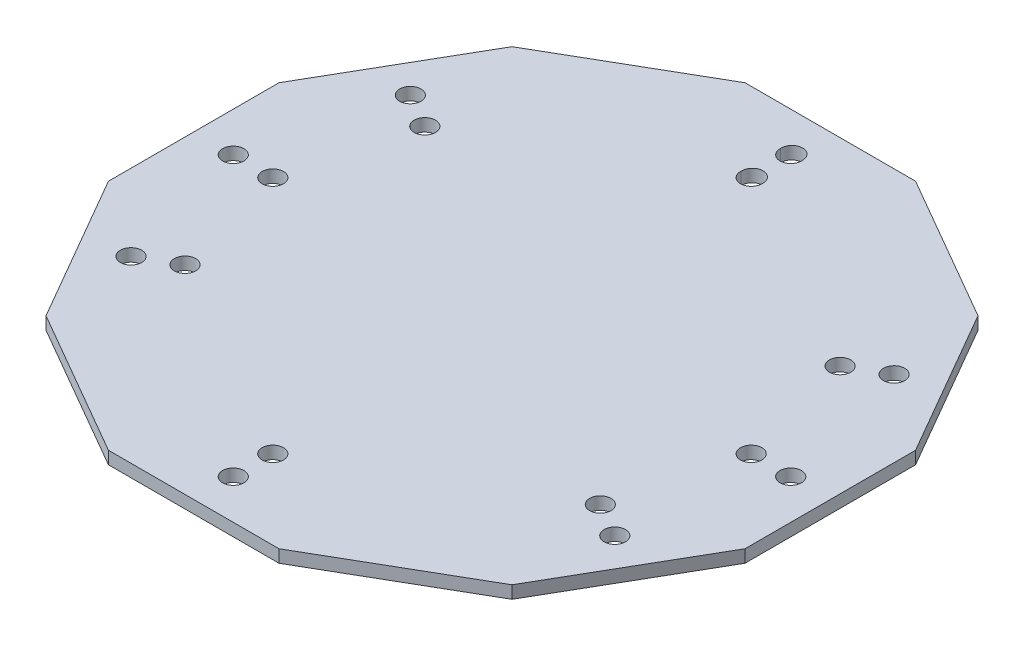
ISO-10303-21;
HEADER;
FILE_DESCRIPTION(('STEP AP214'),'2;1');
FILE_NAME('part.step','',(''),(''),'','','');
FILE_SCHEMA(('AUTOMOTIVE_DESIGN { 1 0 10303 214 1 1 1 1 }'));
ENDSEC;
DATA;
#1=APPLICATION_CONTEXT('core data for automotive mechanical design processes');
#2=APPLICATION_PROTOCOL_DEFINITION('international standard','automotive_design',2000,#1);
#3=PRODUCT_CONTEXT('',#1,'mechanical');
#4=PRODUCT('Part','Part','',(#3));
#5=PRODUCT_RELATED_PRODUCT_CATEGORY('part','',(#4));
#6=PRODUCT_DEFINITION_FORMATION('','',#4);
#7=PRODUCT_DEFINITION_CONTEXT('part definition',#1,'design');
#8=PRODUCT_DEFINITION('design','',#6,#7);
#9=PRODUCT_DEFINITION_SHAPE('','',#8);
#10=(LENGTH_UNIT() NAMED_UNIT(*) SI_UNIT(.MILLI.,.METRE.));
#11=(NAMED_UNIT(*) PLANE_ANGLE_UNIT() SI_UNIT($,.RADIAN.));
#12=(NAMED_UNIT(*) SI_UNIT($,.STERADIAN.) SOLID_ANGLE_UNIT());
#13=UNCERTAINTY_MEASURE_WITH_UNIT(LENGTH_MEASURE(1.E-05),#10,'distance_accuracy_value','');
#14=(GEOMETRIC_REPRESENTATION_CONTEXT(3) GLOBAL_UNCERTAINTY_ASSIGNED_CONTEXT((#13)) GLOBAL_UNIT_ASSIGNED_CONTEXT((#10,
#11,#12)) REPRESENTATION_CONTEXT('',''));
#15=CARTESIAN_POINT('',(0.,0.,0.));
#16=DIRECTION('',(0.,0.,1.));
#17=DIRECTION('',(1.,0.,0.));
#18=AXIS2_PLACEMENT_3D('',#15,#16,#17);
#19=CARTESIAN_POINT('',(120.740728286133,4.78,32.3523806378155));
#20=DIRECTION('',(-1.,0.,0.));
#21=DIRECTION('',(0.,0.,1.));
#22=AXIS2_PLACEMENT_3D('',#19,#20,#21);
#23=PLANE('',#22);
#24=DIRECTION('',(0.,0.,-1.));
#25=VECTOR('',#24,1.);
#26=CARTESIAN_POINT('',(120.740728286133,0.,32.3523806378155));
#27=LINE('',#26,#25);
#28=CARTESIAN_POINT('',(120.740728286133,0.,32.3523806378155));
#29=VERTEX_POINT('',#28);
#30=CARTESIAN_POINT('',(120.740728286134,0.,-32.3523806378146));
#31=VERTEX_POINT('',#30);
#32=EDGE_CURVE('E215',#29,#31,#27,.T.);
#33=ORIENTED_EDGE('',*,*,#32,.T.);
#34=DIRECTION('',(0.,-1.,0.));
#35=VECTOR('',#34,1.);
#36=CARTESIAN_POINT('',(120.740728286134,4.78,-32.3523806378146));
#37=LINE('',#36,#35);
#38=CARTESIAN_POINT('',(120.740728286134,4.78,-32.3523806378146));
#39=VERTEX_POINT('',#38);
#40=EDGE_CURVE('E302',#39,#31,#37,.T.);
#41=ORIENTED_EDGE('',*,*,#40,.F.);
#42=DIRECTION('',(0.,0.,-1.));
#43=VECTOR('',#42,1.);
#44=CARTESIAN_POINT('',(120.740728286133,4.78,32.3523806378155));
#45=LINE('',#44,#43);
#46=CARTESIAN_POINT('',(120.740728286133,4.78,32.3523806378155));
#47=VERTEX_POINT('',#46);
#48=EDGE_CURVE('E220',#47,#39,#45,.T.);
#49=ORIENTED_EDGE('',*,*,#48,.F.);
#50=DIRECTION('',(0.,-1.,0.));
#51=VECTOR('',#50,1.);
#52=CARTESIAN_POINT('',(120.740728286133,4.78,32.3523806378155));
#53=LINE('',#52,#51);
#54=EDGE_CURVE('E246',#47,#29,#53,.T.);
#55=ORIENTED_EDGE('',*,*,#54,.T.);
#56=EDGE_LOOP('',(#33,#41,#49,#55));
#57=FACE_BOUND('',#56,.T.);
#58=ADVANCED_FACE('F37',(#57),#23,.F.);
#59=CARTESIAN_POINT('',(120.740728286134,4.78,-32.3523806378146));
#60=DIRECTION('',(-0.86602540378444,0.,0.499999999999997));
#61=DIRECTION('',(0.499999999999997,0.,0.86602540378444));
#62=AXIS2_PLACEMENT_3D('',#59,#60,#61);
#63=PLANE('',#62);
#64=DIRECTION('',(-0.499999999999997,0.,-0.86602540378444));
#65=VECTOR('',#64,1.);
#66=CARTESIAN_POINT('',(120.740728286134,0.,-32.3523806378146));
#67=LINE('',#66,#65);
#68=CARTESIAN_POINT('',(88.3883476483187,0.,-88.3883476483181));
#69=VERTEX_POINT('',#68);
#70=EDGE_CURVE('E249',#31,#69,#67,.T.);
#71=ORIENTED_EDGE('',*,*,#70,.T.);
#72=DIRECTION('',(0.,-1.,0.));
#73=VECTOR('',#72,1.);
#74=CARTESIAN_POINT('',(88.3883476483187,4.78,-88.3883476483181));
#75=LINE('',#74,#73);
#76=CARTESIAN_POINT('',(88.3883476483187,4.78,-88.3883476483181));
#77=VERTEX_POINT('',#76);
#78=EDGE_CURVE('E299',#77,#69,#75,.T.);
#79=ORIENTED_EDGE('',*,*,#78,.F.);
#80=DIRECTION('',(-0.499999999999997,0.,-0.86602540378444));
#81=VECTOR('',#80,1.);
#82=CARTESIAN_POINT('',(120.740728286134,4.78,-32.3523806378146));
#83=LINE('',#82,#81);
#84=EDGE_CURVE('E223',#39,#77,#83,.T.);
#85=ORIENTED_EDGE('',*,*,#84,.F.);
#86=ORIENTED_EDGE('',*,*,#40,.T.);
#87=EDGE_LOOP('',(#71,#79,#85,#86));
#88=FACE_BOUND('',#87,.T.);
#89=ADVANCED_FACE('F381',(#88),#63,.F.);
#90=CARTESIAN_POINT('',(88.3883476483187,4.78,-88.3883476483181));
#91=DIRECTION('',(-0.500000000000003,0.,0.866025403784437));
#92=DIRECTION('',(0.866025403784437,0.,0.500000000000003));
#93=AXIS2_PLACEMENT_3D('',#90,#91,#92);
#94=PLANE('',#93);
#95=DIRECTION('',(-0.866025403784437,0.,-0.500000000000003));
#96=VECTOR('',#95,1.);
#97=CARTESIAN_POINT('',(88.3883476483187,0.,-88.3883476483181));
#98=LINE('',#97,#96);
#99=CARTESIAN_POINT('',(32.3523806378154,0.,-120.740728286133));
#100=VERTEX_POINT('',#99);
#101=EDGE_CURVE('E251',#69,#100,#98,.T.);
#102=ORIENTED_EDGE('',*,*,#101,.T.);
#103=DIRECTION('',(0.,-1.,0.));
#104=VECTOR('',#103,1.);
#105=CARTESIAN_POINT('',(32.3523806378154,4.78,-120.740728286133));
#106=LINE('',#105,#104);
#107=CARTESIAN_POINT('',(32.3523806378154,4.78,-120.740728286133));
#108=VERTEX_POINT('',#107);
#109=EDGE_CURVE('E296',#108,#100,#106,.T.);
#110=ORIENTED_EDGE('',*,*,#109,.F.);
#111=DIRECTION('',(-0.866025403784437,0.,-0.500000000000003));
#112=VECTOR('',#111,1.);
#113=CARTESIAN_POINT('',(88.3883476483187,4.78,-88.3883476483181));
#114=LINE('',#113,#112);
#115=EDGE_CURVE('E226',#77,#108,#114,.T.);
#116=ORIENTED_EDGE('',*,*,#115,.F.);
#117=ORIENTED_EDGE('',*,*,#78,.T.);
#118=EDGE_LOOP('',(#102,#110,#116,#117));
#119=FACE_BOUND('',#118,.T.);
#120=ADVANCED_FACE('F386',(#119),#94,.F.);
#121=CARTESIAN_POINT('',(32.3523806378154,4.78,-120.740728286133));
#122=DIRECTION('',(0.,0.,1.));
#123=DIRECTION('',(1.,0.,0.));
#124=AXIS2_PLACEMENT_3D('',#121,#122,#123);
#125=PLANE('',#124);
#126=DIRECTION('',(-1.,0.,0.));
#127=VECTOR('',#126,1.);
#128=CARTESIAN_POINT('',(32.3523806378154,0.,-120.740728286133));
#129=LINE('',#128,#127);
#130=CARTESIAN_POINT('',(-32.3523806378146,0.,-120.740728286134));
#131=VERTEX_POINT('',#130);
#132=EDGE_CURVE('E253',#100,#131,#129,.T.);
#133=ORIENTED_EDGE('',*,*,#132,.T.);
#134=DIRECTION('',(0.,-1.,0.));
#135=VECTOR('',#134,1.);
#136=CARTESIAN_POINT('',(-32.3523806378146,4.78,-120.740728286134));
#137=LINE('',#136,#135);
#138=CARTESIAN_POINT('',(-32.3523806378146,4.78,-120.740728286134));
#139=VERTEX_POINT('',#138);
#140=EDGE_CURVE('E293',#139,#131,#137,.T.);
#141=ORIENTED_EDGE('',*,*,#140,.F.);
#142=DIRECTION('',(-1.,0.,0.));
#143=VECTOR('',#142,1.);
#144=CARTESIAN_POINT('',(32.3523806378154,4.78,-120.740728286133));
#145=LINE('',#144,#143);
#146=EDGE_CURVE('E228',#108,#139,#145,.T.);
#147=ORIENTED_EDGE('',*,*,#146,.F.);
#148=ORIENTED_EDGE('',*,*,#109,.T.);
#149=EDGE_LOOP('',(#133,#141,#147,#148));
#150=FACE_BOUND('',#149,.T.);
#151=ADVANCED_FACE('F392',(#150),#125,.F.);
#152=CARTESIAN_POINT('',(-32.3523806378146,4.78,-120.740728286134));
#153=DIRECTION('',(0.499999999999997,0.,0.86602540378444));
#154=DIRECTION('',(0.86602540378444,0.,-0.499999999999997));
#155=AXIS2_PLACEMENT_3D('',#152,#153,#154);
#156=PLANE('',#155);
#157=DIRECTION('',(-0.86602540378444,0.,0.499999999999997));
#158=VECTOR('',#157,1.);
#159=CARTESIAN_POINT('',(-32.3523806378146,0.,-120.740728286134));
#160=LINE('',#159,#158);
#161=CARTESIAN_POINT('',(-88.3883476483181,0.,-88.3883476483187));
#162=VERTEX_POINT('',#161);
#163=EDGE_CURVE('E255',#131,#162,#160,.T.);
#164=ORIENTED_EDGE('',*,*,#163,.T.);
#165=DIRECTION('',(0.,-1.,0.));
#166=VECTOR('',#165,1.);
#167=CARTESIAN_POINT('',(-88.3883476483181,4.78,-88.3883476483187));
#168=LINE('',#167,#166);
#169=CARTESIAN_POINT('',(-88.3883476483181,4.78,-88.3883476483187));
#170=VERTEX_POINT('',#169);
#171=EDGE_CURVE('E290',#170,#162,#168,.T.);
#172=ORIENTED_EDGE('',*,*,#171,.F.);
#173=DIRECTION('',(-0.86602540378444,0.,0.499999999999997));
#174=VECTOR('',#173,1.);
#175=CARTESIAN_POINT('',(-32.3523806378146,4.78,-120.740728286134));
#176=LINE('',#175,#174);
#177=EDGE_CURVE('E230',#139,#170,#176,.T.);
#178=ORIENTED_EDGE('',*,*,#177,.F.);
#179=ORIENTED_EDGE('',*,*,#140,.T.);
#180=EDGE_LOOP('',(#164,#172,#178,#179));
#181=FACE_BOUND('',#180,.T.);
#182=ADVANCED_FACE('F396',(#181),#156,.F.);
#183=CARTESIAN_POINT('',(-88.3883476483181,4.78,-88.3883476483187));
#184=DIRECTION('',(0.866025403784437,0.,0.500000000000003));
#185=DIRECTION('',(0.500000000000003,0.,-0.866025403784437));
#186=AXIS2_PLACEMENT_3D('',#183,#184,#185);
#187=PLANE('',#186);
#188=DIRECTION('',(-0.500000000000003,0.,0.866025403784437));
#189=VECTOR('',#188,1.);
#190=CARTESIAN_POINT('',(-88.3883476483181,0.,-88.3883476483187));
#191=LINE('',#190,#189);
#192=CARTESIAN_POINT('',(-120.740728286133,0.,-32.3523806378155));
#193=VERTEX_POINT('',#192);
#194=EDGE_CURVE('E257',#162,#193,#191,.T.);
#195=ORIENTED_EDGE('',*,*,#194,.T.);
#196=DIRECTION('',(0.,-1.,0.));
#197=VECTOR('',#196,1.);
#198=CARTESIAN_POINT('',(-120.740728286133,4.78,-32.3523806378155));
#199=LINE('',#198,#197);
#200=CARTESIAN_POINT('',(-120.740728286133,4.78,-32.3523806378155));
#201=VERTEX_POINT('',#200);
#202=EDGE_CURVE('E287',#201,#193,#199,.T.);
#203=ORIENTED_EDGE('',*,*,#202,.F.);
#204=DIRECTION('',(-0.500000000000003,0.,0.866025403784437));
#205=VECTOR('',#204,1.);
#206=CARTESIAN_POINT('',(-88.3883476483181,4.78,-88.3883476483187));
#207=LINE('',#206,#205);
#208=EDGE_CURVE('E232',#170,#201,#207,.T.);
#209=ORIENTED_EDGE('',*,*,#208,.F.);
#210=ORIENTED_EDGE('',*,*,#171,.T.);
#211=EDGE_LOOP('',(#195,#203,#209,#210));
#212=FACE_BOUND('',#211,.T.);
#213=ADVANCED_FACE('F401',(#212),#187,.F.);
#214=CARTESIAN_POINT('',(-120.740728286133,4.78,-32.3523806378155));
#215=DIRECTION('',(1.,0.,0.));
#216=DIRECTION('',(0.,0.,-1.));
#217=AXIS2_PLACEMENT_3D('',#214,#215,#216);
#218=PLANE('',#217);
#219=DIRECTION('',(0.,0.,1.));
#220=VECTOR('',#219,1.);
#221=CARTESIAN_POINT('',(-120.740728286133,0.,-32.3523806378155));
#222=LINE('',#221,#220);
#223=CARTESIAN_POINT('',(-120.740728286134,0.,32.3523806378146));
#224=VERTEX_POINT('',#223);
#225=EDGE_CURVE('E259',#193,#224,#222,.T.);
#226=ORIENTED_EDGE('',*,*,#225,.T.);
#227=DIRECTION('',(0.,-1.,0.));
#228=VECTOR('',#227,1.);
#229=CARTESIAN_POINT('',(-120.740728286134,4.78,32.3523806378146));
#230=LINE('',#229,#228);
#231=CARTESIAN_POINT('',(-120.740728286134,4.78,32.3523806378146));
#232=VERTEX_POINT('',#231);
#233=EDGE_CURVE('E284',#232,#224,#230,.T.);
#234=ORIENTED_EDGE('',*,*,#233,.F.);
#235=DIRECTION('',(0.,0.,1.));
#236=VECTOR('',#235,1.);
#237=CARTESIAN_POINT('',(-120.740728286133,4.78,-32.3523806378155));
#238=LINE('',#237,#236);
#239=EDGE_CURVE('E234',#201,#232,#238,.T.);
#240=ORIENTED_EDGE('',*,*,#239,.F.);
#241=ORIENTED_EDGE('',*,*,#202,.T.);
#242=EDGE_LOOP('',(#226,#234,#240,#241));
#243=FACE_BOUND('',#242,.T.);
#244=ADVANCED_FACE('F407',(#243),#218,.F.);
#245=CARTESIAN_POINT('',(-120.740728286134,4.78,32.3523806378146));
#246=DIRECTION('',(0.86602540378444,0.,-0.499999999999997));
#247=DIRECTION('',(-0.499999999999997,0.,-0.86602540378444));
#248=AXIS2_PLACEMENT_3D('',#245,#246,#247);
#249=PLANE('',#248);
#250=DIRECTION('',(0.499999999999997,0.,0.86602540378444));
#251=VECTOR('',#250,1.);
#252=CARTESIAN_POINT('',(-120.740728286134,0.,32.3523806378146));
#253=LINE('',#252,#251);
#254=CARTESIAN_POINT('',(-88.3883476483187,0.,88.3883476483181));
#255=VERTEX_POINT('',#254);
#256=EDGE_CURVE('E261',#224,#255,#253,.T.);
#257=ORIENTED_EDGE('',*,*,#256,.T.);
#258=DIRECTION('',(0.,-1.,0.));
#259=VECTOR('',#258,1.);
#260=CARTESIAN_POINT('',(-88.3883476483187,4.78,88.3883476483181));
#261=LINE('',#260,#259);
#262=CARTESIAN_POINT('',(-88.3883476483187,4.78,88.3883476483181));
#263=VERTEX_POINT('',#262);
#264=EDGE_CURVE('E281',#263,#255,#261,.T.);
#265=ORIENTED_EDGE('',*,*,#264,.F.);
#266=DIRECTION('',(0.499999999999997,0.,0.86602540378444));
#267=VECTOR('',#266,1.);
#268=CARTESIAN_POINT('',(-120.740728286134,4.78,32.3523806378146));
#269=LINE('',#268,#267);
#270=EDGE_CURVE('E236',#232,#263,#269,.T.);
#271=ORIENTED_EDGE('',*,*,#270,.F.);
#272=ORIENTED_EDGE('',*,*,#233,.T.);
#273=EDGE_LOOP('',(#257,#265,#271,#272));
#274=FACE_BOUND('',#273,.T.);
#275=ADVANCED_FACE('F411',(#274),#249,.F.);
#276=CARTESIAN_POINT('',(-88.3883476483187,4.78,88.3883476483181));
#277=DIRECTION('',(0.500000000000003,0.,-0.866025403784437));
#278=DIRECTION('',(-0.866025403784437,0.,-0.500000000000003));
#279=AXIS2_PLACEMENT_3D('',#276,#277,#278);
#280=PLANE('',#279);
#281=DIRECTION('',(0.866025403784437,0.,0.500000000000003));
#282=VECTOR('',#281,1.);
#283=CARTESIAN_POINT('',(-88.3883476483187,0.,88.3883476483181));
#284=LINE('',#283,#282);
#285=CARTESIAN_POINT('',(-32.3523806378154,0.,120.740728286133));
#286=VERTEX_POINT('',#285);
#287=EDGE_CURVE('E263',#255,#286,#284,.T.);
#288=ORIENTED_EDGE('',*,*,#287,.T.);
#289=DIRECTION('',(0.,-1.,0.));
#290=VECTOR('',#289,1.);
#291=CARTESIAN_POINT('',(-32.3523806378154,4.78,120.740728286133));
#292=LINE('',#291,#290);
#293=CARTESIAN_POINT('',(-32.3523806378154,4.78,120.740728286133));
#294=VERTEX_POINT('',#293);
#295=EDGE_CURVE('E278',#294,#286,#292,.T.);
#296=ORIENTED_EDGE('',*,*,#295,.F.);
#297=DIRECTION('',(0.866025403784437,0.,0.500000000000003));
#298=VECTOR('',#297,1.);
#299=CARTESIAN_POINT('',(-88.3883476483187,4.78,88.3883476483181));
#300=LINE('',#299,#298);
#301=EDGE_CURVE('E238',#263,#294,#300,.T.);
#302=ORIENTED_EDGE('',*,*,#301,.F.);
#303=ORIENTED_EDGE('',*,*,#264,.T.);
#304=EDGE_LOOP('',(#288,#296,#302,#303));
#305=FACE_BOUND('',#304,.T.);
#306=ADVANCED_FACE('F416',(#305),#280,.F.);
#307=CARTESIAN_POINT('',(-32.3523806378154,4.78,120.740728286133));
#308=DIRECTION('',(0.,0.,-1.));
#309=DIRECTION('',(-1.,0.,0.));
#310=AXIS2_PLACEMENT_3D('',#307,#308,#309);
#311=PLANE('',#310);
#312=DIRECTION('',(1.,0.,0.));
#313=VECTOR('',#312,1.);
#314=CARTESIAN_POINT('',(-32.3523806378154,0.,120.740728286133));
#315=LINE('',#314,#313);
#316=CARTESIAN_POINT('',(32.3523806378146,0.,120.740728286134));
#317=VERTEX_POINT('',#316);
#318=EDGE_CURVE('E265',#286,#317,#315,.T.);
#319=ORIENTED_EDGE('',*,*,#318,.T.);
#320=DIRECTION('',(0.,-1.,0.));
#321=VECTOR('',#320,1.);
#322=CARTESIAN_POINT('',(32.3523806378146,4.78,120.740728286134));
#323=LINE('',#322,#321);
#324=CARTESIAN_POINT('',(32.3523806378146,4.78,120.740728286134));
#325=VERTEX_POINT('',#324);
#326=EDGE_CURVE('E275',#325,#317,#323,.T.);
#327=ORIENTED_EDGE('',*,*,#326,.F.);
#328=DIRECTION('',(1.,0.,0.));
#329=VECTOR('',#328,1.);
#330=CARTESIAN_POINT('',(-32.3523806378154,4.78,120.740728286133));
#331=LINE('',#330,#329);
#332=EDGE_CURVE('E240',#294,#325,#331,.T.);
#333=ORIENTED_EDGE('',*,*,#332,.F.);
#334=ORIENTED_EDGE('',*,*,#295,.T.);
#335=EDGE_LOOP('',(#319,#327,#333,#334));
#336=FACE_BOUND('',#335,.T.);
#337=ADVANCED_FACE('F422',(#336),#311,.F.);
#338=CARTESIAN_POINT('',(32.3523806378146,4.78,120.740728286134));
#339=DIRECTION('',(-0.499999999999997,0.,-0.86602540378444));
#340=DIRECTION('',(-0.86602540378444,0.,0.499999999999997));
#341=AXIS2_PLACEMENT_3D('',#338,#339,#340);
#342=PLANE('',#341);
#343=DIRECTION('',(0.86602540378444,0.,-0.499999999999997));
#344=VECTOR('',#343,1.);
#345=CARTESIAN_POINT('',(32.3523806378146,0.,120.740728286134));
#346=LINE('',#345,#344);
#347=CARTESIAN_POINT('',(88.3883476483181,0.,88.3883476483187));
#348=VERTEX_POINT('',#347);
#349=EDGE_CURVE('E267',#317,#348,#346,.T.);
#350=ORIENTED_EDGE('',*,*,#349,.T.);
#351=DIRECTION('',(0.,-1.,0.));
#352=VECTOR('',#351,1.);
#353=CARTESIAN_POINT('',(88.3883476483181,4.78,88.3883476483187));
#354=LINE('',#353,#352);
#355=CARTESIAN_POINT('',(88.3883476483181,4.78,88.3883476483187));
#356=VERTEX_POINT('',#355);
#357=EDGE_CURVE('E272',#356,#348,#354,.T.);
#358=ORIENTED_EDGE('',*,*,#357,.F.);
#359=DIRECTION('',(0.86602540378444,0.,-0.499999999999997));
#360=VECTOR('',#359,1.);
#361=CARTESIAN_POINT('',(32.3523806378146,4.78,120.740728286134));
#362=LINE('',#361,#360);
#363=EDGE_CURVE('E242',#325,#356,#362,.T.);
#364=ORIENTED_EDGE('',*,*,#363,.F.);
#365=ORIENTED_EDGE('',*,*,#326,.T.);
#366=EDGE_LOOP('',(#350,#358,#364,#365));
#367=FACE_BOUND('',#366,.T.);
#368=ADVANCED_FACE('F426',(#367),#342,.F.);
#369=CARTESIAN_POINT('',(88.3883476483181,4.78,88.3883476483187));
#370=DIRECTION('',(-0.866025403784437,0.,-0.500000000000003));
#371=DIRECTION('',(-0.500000000000003,0.,0.866025403784437));
#372=AXIS2_PLACEMENT_3D('',#369,#370,#371);
#373=PLANE('',#372);
#374=DIRECTION('',(0.500000000000003,0.,-0.866025403784437));
#375=VECTOR('',#374,1.);
#376=CARTESIAN_POINT('',(88.3883476483181,0.,88.3883476483187));
#377=LINE('',#376,#375);
#378=EDGE_CURVE('E224',#348,#29,#377,.T.);
#379=ORIENTED_EDGE('',*,*,#378,.T.);
#380=ORIENTED_EDGE('',*,*,#54,.F.);
#381=DIRECTION('',(0.500000000000003,0.,-0.866025403784437));
#382=VECTOR('',#381,1.);
#383=CARTESIAN_POINT('',(88.3883476483181,4.78,88.3883476483187));
#384=LINE('',#383,#382);
#385=EDGE_CURVE('E244',#356,#47,#384,.T.);
#386=ORIENTED_EDGE('',*,*,#385,.F.);
#387=ORIENTED_EDGE('',*,*,#357,.T.);
#388=EDGE_LOOP('',(#379,#380,#386,#387));
#389=FACE_BOUND('',#388,.T.);
#390=ADVANCED_FACE('F362',(#389),#373,.F.);
#391=CARTESIAN_POINT('',(0.,4.78,0.));
#392=DIRECTION('',(0.,1.,0.));
#393=DIRECTION('',(0.,0.,1.));
#394=AXIS2_PLACEMENT_3D('',#391,#392,#393);
#395=PLANE('',#394);
#396=CARTESIAN_POINT('',(105.737834451521,4.78,0.00527433217952002));
#397=DIRECTION('',(0.,1.,0.));
#398=DIRECTION('',(1.,0.,0.));
#399=AXIS2_PLACEMENT_3D('',#396,#397,#398);
#400=CIRCLE('',#399,4.05);
#401=CARTESIAN_POINT('',(109.787834451521,4.78,0.00527433217950588));
#402=VERTEX_POINT('',#401);
#403=EDGE_CURVE('E656',#402,#402,#400,.T.);
#404=ORIENTED_EDGE('',*,*,#403,.F.);
#405=EDGE_LOOP('',(#404));
#406=FACE_BOUND('',#405,.T.);
#407=CARTESIAN_POINT('',(-90.7378345917689,4.78,0.00051319679742557));
#408=DIRECTION('',(0.,1.,0.));
#409=DIRECTION('',(-1.,0.,0.));
#410=AXIS2_PLACEMENT_3D('',#407,#408,#409);
#411=CIRCLE('',#410,4.05);
#412=CARTESIAN_POINT('',(-94.7878345917689,4.78,0.000513196797467992));
#413=VERTEX_POINT('',#412);
#414=EDGE_CURVE('E661',#413,#413,#411,.T.);
#415=ORIENTED_EDGE('',*,*,#414,.F.);
#416=EDGE_LOOP('',(#415));
#417=FACE_BOUND('',#416,.T.);
#418=CARTESIAN_POINT('',(90.7378344515214,4.78,0.00527433217957239));
#419=DIRECTION('',(0.,1.,0.));
#420=DIRECTION('',(1.,0.,0.));
#421=AXIS2_PLACEMENT_3D('',#418,#419,#420);
#422=CIRCLE('',#421,4.05);
#423=CARTESIAN_POINT('',(94.7878344515214,4.78,0.00527433217955825));
#424=VERTEX_POINT('',#423);
#425=EDGE_CURVE('E312',#424,#424,#422,.T.);
#426=ORIENTED_EDGE('',*,*,#425,.F.);
#427=EDGE_LOOP('',(#426));
#428=FACE_BOUND('',#427,.T.);
#429=CARTESIAN_POINT('',(0.00238049756797149,4.78,-105.734940757157));
#430=DIRECTION('',(0.,1.,0.));
#431=DIRECTION('',(0.,0.,-1.));
#432=AXIS2_PLACEMENT_3D('',#429,#430,#431);
#433=CIRCLE('',#432,4.05);
#434=CARTESIAN_POINT('',(-4.04166906785761,4.78,-105.954401715829));
#435=VERTEX_POINT('',#434);
#436=CARTESIAN_POINT('',(4.04644069450592,4.78,-105.954205719114));
#437=VERTEX_POINT('',#436);
#438=EDGE_CURVE('E162',#435,#437,#433,.T.);
#439=ORIENTED_EDGE('',*,*,#438,.F.);
#440=CARTESIAN_POINT('',(0.00239112908033923,4.78,-106.173666677786));
#441=DIRECTION('',(0.,1.,0.));
#442=DIRECTION('',(0.,0.,-1.));
#443=AXIS2_PLACEMENT_3D('',#440,#441,#442);
#444=CIRCLE('',#443,4.05);
#445=EDGE_CURVE('E165',#437,#435,#444,.T.);
#446=ORIENTED_EDGE('',*,*,#445,.F.);
#447=EDGE_LOOP('',(#439,#446));
#448=FACE_BOUND('',#447,.T.);
#449=CARTESIAN_POINT('',(0.00238049756797149,4.78,-90.734940757157));
#450=DIRECTION('',(0.,1.,0.));
#451=DIRECTION('',(0.,0.,-1.));
#452=AXIS2_PLACEMENT_3D('',#449,#450,#451);
#453=CIRCLE('',#452,4.05);
#454=CARTESIAN_POINT('',(-4.04166906785761,4.78,-90.9544017158287));
#455=VERTEX_POINT('',#454);
#456=CARTESIAN_POINT('',(4.04644069450592,4.78,-90.9542057191143));
#457=VERTEX_POINT('',#456);
#458=EDGE_CURVE('E150',#455,#457,#453,.T.);
#459=ORIENTED_EDGE('',*,*,#458,.F.);
#460=CARTESIAN_POINT('',(0.00239112908033923,4.78,-91.173666677786));
#461=DIRECTION('',(0.,1.,0.));
#462=DIRECTION('',(0.,0.,-1.));
#463=AXIS2_PLACEMENT_3D('',#460,#461,#462);
#464=CIRCLE('',#463,4.05);
#465=EDGE_CURVE('E166',#457,#455,#464,.T.);
#466=ORIENTED_EDGE('',*,*,#465,.F.);
#467=EDGE_LOOP('',(#459,#466));
#468=FACE_BOUND('',#467,.T.);
#469=CARTESIAN_POINT('',(-105.737834591769,4.78,0.000513196797582687));
#470=DIRECTION('',(0.,1.,0.));
#471=DIRECTION('',(-1.,0.,0.));
#472=AXIS2_PLACEMENT_3D('',#469,#470,#471);
#473=CIRCLE('',#472,4.05);
#474=CARTESIAN_POINT('',(-109.787834591769,4.78,0.000513196797625108));
#475=VERTEX_POINT('',#474);
#476=EDGE_CURVE('E667',#475,#475,#473,.T.);
#477=ORIENTED_EDGE('',*,*,#476,.F.);
#478=EDGE_LOOP('',(#477));
#479=FACE_BOUND('',#478,.T.);
#480=CARTESIAN_POINT('',(-91.7604265458257,4.78,-53.1971341724817));
#481=DIRECTION('',(0.,1.,0.));
#482=DIRECTION('',(-0.866025403784443,0.,-0.499999999999992));
#483=AXIS2_PLACEMENT_3D('',#480,#481,#482);
#484=CIRCLE('',#483,4.05);
#485=CARTESIAN_POINT('',(-95.2678294311527,4.78,-55.2221341724816));
#486=VERTEX_POINT('',#485);
#487=EDGE_CURVE('E175',#486,#486,#484,.T.);
#488=ORIENTED_EDGE('',*,*,#487,.F.);
#489=EDGE_LOOP('',(#488));
#490=FACE_BOUND('',#489,.T.);
#491=CARTESIAN_POINT('',(-78.7700454890591,4.78,-45.6971341724818));
#492=DIRECTION('',(0.,1.,0.));
#493=DIRECTION('',(-0.866025403784443,0.,-0.499999999999992));
#494=AXIS2_PLACEMENT_3D('',#491,#492,#493);
#495=CIRCLE('',#494,4.05);
#496=CARTESIAN_POINT('',(-82.2774483743861,4.78,-47.7221341724818));
#497=VERTEX_POINT('',#496);
#498=EDGE_CURVE('E328',#497,#497,#495,.T.);
#499=ORIENTED_EDGE('',*,*,#498,.F.);
#500=EDGE_LOOP('',(#499));
#501=FACE_BOUND('',#500,.T.);
#502=CARTESIAN_POINT('',(-91.7628124292725,4.78,52.7600633094782));
#503=DIRECTION('',(0.,1.,0.));
#504=DIRECTION('',(-0.866025403784433,0.,0.50000000000001));
#505=AXIS2_PLACEMENT_3D('',#502,#503,#504);
#506=CIRCLE('',#505,4.05);
#507=CARTESIAN_POINT('',(-95.2702153145995,4.78,54.7850633094783));
#508=VERTEX_POINT('',#507);
#509=EDGE_CURVE('E327',#508,#508,#506,.T.);
#510=ORIENTED_EDGE('',*,*,#509,.F.);
#511=EDGE_LOOP('',(#510));
#512=FACE_BOUND('',#511,.T.);
#513=CARTESIAN_POINT('',(78.7700559803237,4.78,45.2641957808297));
#514=DIRECTION('',(0.,1.,0.));
#515=DIRECTION('',(0.86602540378444,0.,0.499999999999998));
#516=AXIS2_PLACEMENT_3D('',#513,#514,#515);
#517=CIRCLE('',#516,4.05);
#518=CARTESIAN_POINT('',(82.2774588656506,4.78,47.2891957808297));
#519=VERTEX_POINT('',#518);
#520=EDGE_CURVE('E190',#519,#519,#517,.T.);
#521=ORIENTED_EDGE('',*,*,#520,.F.);
#522=EDGE_LOOP('',(#521));
#523=FACE_BOUND('',#522,.T.);
#524=CARTESIAN_POINT('',(91.7628229205378,4.78,-53.1930017011303));
#525=DIRECTION('',(0.,1.,0.));
#526=DIRECTION('',(0.866025403784436,0.,-0.500000000000004));
#527=AXIS2_PLACEMENT_3D('',#524,#525,#526);
#528=CIRCLE('',#527,4.05);
#529=CARTESIAN_POINT('',(95.2702258058648,4.78,-55.2180017011303));
#530=VERTEX_POINT('',#529);
#531=EDGE_CURVE('E186',#530,#530,#528,.T.);
#532=ORIENTED_EDGE('',*,*,#531,.F.);
#533=EDGE_LOOP('',(#532));
#534=FACE_BOUND('',#533,.T.);
#535=CARTESIAN_POINT('',(78.7724418637713,4.78,-45.6930017011302));
#536=DIRECTION('',(0.,1.,0.));
#537=DIRECTION('',(0.866025403784436,0.,-0.500000000000004));
#538=AXIS2_PLACEMENT_3D('',#535,#536,#537);
#539=CIRCLE('',#538,4.05);
#540=CARTESIAN_POINT('',(82.2798447490982,4.78,-47.7180017011302));
#541=VERTEX_POINT('',#540);
#542=EDGE_CURVE('E181',#541,#541,#539,.T.);
#543=ORIENTED_EDGE('',*,*,#542,.F.);
#544=EDGE_LOOP('',(#543));
#545=FACE_BOUND('',#544,.T.);
#546=CARTESIAN_POINT('',(-78.772431372506,4.78,45.2600633094781));
#547=DIRECTION('',(0.,1.,0.));
#548=DIRECTION('',(-0.866025403784433,0.,0.50000000000001));
#549=AXIS2_PLACEMENT_3D('',#546,#547,#548);
#550=CIRCLE('',#549,4.05);
#551=CARTESIAN_POINT('',(-82.279834257833,4.78,47.2850633094781));
#552=VERTEX_POINT('',#551);
#553=EDGE_CURVE('E320',#552,#552,#550,.T.);
#554=ORIENTED_EDGE('',*,*,#553,.F.);
#555=EDGE_LOOP('',(#554));
#556=FACE_BOUND('',#555,.T.);
#557=CARTESIAN_POINT('',(91.7604370370903,4.78,52.7641957808296));
#558=DIRECTION('',(0.,1.,0.));
#559=DIRECTION('',(0.86602540378444,0.,0.499999999999998));
#560=AXIS2_PLACEMENT_3D('',#557,#558,#559);
#561=CIRCLE('',#560,4.05);
#562=CARTESIAN_POINT('',(95.2678399224173,4.78,54.7891957808296));
#563=VERTEX_POINT('',#562);
#564=EDGE_CURVE('E197',#563,#563,#561,.T.);
#565=ORIENTED_EDGE('',*,*,#564,.F.);
#566=EDGE_LOOP('',(#565));
#567=FACE_BOUND('',#566,.T.);
#568=CARTESIAN_POINT('',(-0.00238063781544257,4.78,105.740728286133));
#569=DIRECTION('',(0.,1.,0.));
#570=DIRECTION('',(0.,0.,1.));
#571=AXIS2_PLACEMENT_3D('',#568,#569,#570);
#572=CIRCLE('',#571,4.05);
#573=CARTESIAN_POINT('',(-0.00238063781544257,4.78,109.790728286133));
#574=VERTEX_POINT('',#573);
#575=EDGE_CURVE('E208',#574,#574,#572,.T.);
#576=ORIENTED_EDGE('',*,*,#575,.F.);
#577=EDGE_LOOP('',(#576));
#578=FACE_BOUND('',#577,.T.);
#579=CARTESIAN_POINT('',(-0.00238063781544257,4.78,90.7407282861333));
#580=DIRECTION('',(0.,1.,0.));
#581=DIRECTION('',(0.,0.,1.));
#582=AXIS2_PLACEMENT_3D('',#579,#580,#581);
#583=CIRCLE('',#582,4.05);
#584=CARTESIAN_POINT('',(-0.00238063781544257,4.78,94.7907282861333));
#585=VERTEX_POINT('',#584);
#586=EDGE_CURVE('E207',#585,#585,#583,.T.);
#587=ORIENTED_EDGE('',*,*,#586,.F.);
#588=EDGE_LOOP('',(#587));
#589=FACE_BOUND('',#588,.T.);
#590=ORIENTED_EDGE('',*,*,#48,.T.);
#591=ORIENTED_EDGE('',*,*,#84,.T.);
#592=ORIENTED_EDGE('',*,*,#115,.T.);
#593=ORIENTED_EDGE('',*,*,#146,.T.);
#594=ORIENTED_EDGE('',*,*,#177,.T.);
#595=ORIENTED_EDGE('',*,*,#208,.T.);
#596=ORIENTED_EDGE('',*,*,#239,.T.);
#597=ORIENTED_EDGE('',*,*,#270,.T.);
#598=ORIENTED_EDGE('',*,*,#301,.T.);
#599=ORIENTED_EDGE('',*,*,#332,.T.);
#600=ORIENTED_EDGE('',*,*,#363,.T.);
#601=ORIENTED_EDGE('',*,*,#385,.T.);
#602=EDGE_LOOP('',(#590,#591,#592,#593,#594,#595,#596,#597,#598,#599,#600,#601));
#603=FACE_BOUND('',#602,.T.);
#604=ADVANCED_FACE('F344',(#406,#417,#428,#448,#468,#479,#490,#501,#512,#523,#534,#545,#556,
#567,#578,#589,#603),#395,.T.);
#605=CARTESIAN_POINT('',(0.,0.,0.));
#606=DIRECTION('',(0.,1.,0.));
#607=DIRECTION('',(0.,0.,1.));
#608=AXIS2_PLACEMENT_3D('',#605,#606,#607);
#609=PLANE('',#608);
#610=CARTESIAN_POINT('',(105.737834451521,0.,0.00527433217952002));
#611=DIRECTION('',(0.,1.,0.));
#612=DIRECTION('',(0.,0.,1.));
#613=AXIS2_PLACEMENT_3D('',#610,#611,#612);
#614=CIRCLE('',#613,4.05);
#615=CARTESIAN_POINT('',(105.737834451521,0.,4.05527433217952));
#616=VERTEX_POINT('',#615);
#617=EDGE_CURVE('E324',#616,#616,#614,.F.);
#618=ORIENTED_EDGE('',*,*,#617,.F.);
#619=EDGE_LOOP('',(#618));
#620=FACE_BOUND('',#619,.T.);
#621=CARTESIAN_POINT('',(-90.7378345917689,0.,0.00051319679742557));
#622=DIRECTION('',(0.,1.,0.));
#623=DIRECTION('',(0.,0.,1.));
#624=AXIS2_PLACEMENT_3D('',#621,#622,#623);
#625=CIRCLE('',#624,4.05);
#626=CARTESIAN_POINT('',(-90.7378345917689,0.,4.05051319679742));
#627=VERTEX_POINT('',#626);
#628=EDGE_CURVE('E664',#627,#627,#625,.F.);
#629=ORIENTED_EDGE('',*,*,#628,.F.);
#630=EDGE_LOOP('',(#629));
#631=FACE_BOUND('',#630,.T.);
#632=CARTESIAN_POINT('',(90.7378344515214,0.,0.00527433217957239));
#633=DIRECTION('',(0.,1.,0.));
#634=DIRECTION('',(0.,0.,1.));
#635=AXIS2_PLACEMENT_3D('',#632,#633,#634);
#636=CIRCLE('',#635,4.05);
#637=CARTESIAN_POINT('',(90.7378344515214,0.,4.05527433217957));
#638=VERTEX_POINT('',#637);
#639=EDGE_CURVE('E315',#638,#638,#636,.F.);
#640=ORIENTED_EDGE('',*,*,#639,.F.);
#641=EDGE_LOOP('',(#640));
#642=FACE_BOUND('',#641,.T.);
#643=CARTESIAN_POINT('',(-105.737834591769,0.,0.000513196797582687));
#644=DIRECTION('',(0.,1.,0.));
#645=DIRECTION('',(0.,0.,1.));
#646=AXIS2_PLACEMENT_3D('',#643,#644,#645);
#647=CIRCLE('',#646,4.05);
#648=CARTESIAN_POINT('',(-105.737834591769,0.,4.05051319679758));
#649=VERTEX_POINT('',#648);
#650=EDGE_CURVE('E668',#649,#649,#647,.F.);
#651=ORIENTED_EDGE('',*,*,#650,.F.);
#652=EDGE_LOOP('',(#651));
#653=FACE_BOUND('',#652,.T.);
#654=CARTESIAN_POINT('',(0.00239112908033923,0.,-91.173666677786));
#655=DIRECTION('',(0.,1.,0.));
#656=DIRECTION('',(0.,0.,1.));
#657=AXIS2_PLACEMENT_3D('',#654,#655,#656);
#658=CIRCLE('',#657,4.05);
#659=CARTESIAN_POINT('',(-4.04166906785761,0.,-90.9544017158287));
#660=VERTEX_POINT('',#659);
#661=CARTESIAN_POINT('',(4.04644069450592,0.,-90.9542057191143));
#662=VERTEX_POINT('',#661);
#663=EDGE_CURVE('E161',#660,#662,#658,.F.);
#664=ORIENTED_EDGE('',*,*,#663,.F.);
#665=CARTESIAN_POINT('',(0.00238049756797149,0.,-90.734940757157));
#666=DIRECTION('',(0.,1.,0.));
#667=DIRECTION('',(0.,0.,1.));
#668=AXIS2_PLACEMENT_3D('',#665,#666,#667);
#669=CIRCLE('',#668,4.05);
#670=EDGE_CURVE('E59',#662,#660,#669,.F.);
#671=ORIENTED_EDGE('',*,*,#670,.F.);
#672=EDGE_LOOP('',(#664,#671));
#673=FACE_BOUND('',#672,.T.);
#674=CARTESIAN_POINT('',(-91.7604265458257,0.,-53.1971341724817));
#675=DIRECTION('',(0.,1.,0.));
#676=DIRECTION('',(0.,0.,1.));
#677=AXIS2_PLACEMENT_3D('',#674,#675,#676);
#678=CIRCLE('',#677,4.05);
#679=CARTESIAN_POINT('',(-91.7604265458257,0.,-49.1471341724817));
#680=VERTEX_POINT('',#679);
#681=EDGE_CURVE('E171',#680,#680,#678,.F.);
#682=ORIENTED_EDGE('',*,*,#681,.F.);
#683=EDGE_LOOP('',(#682));
#684=FACE_BOUND('',#683,.T.);
#685=CARTESIAN_POINT('',(-78.7700454890591,0.,-45.6971341724818));
#686=DIRECTION('',(0.,1.,0.));
#687=DIRECTION('',(0.,0.,1.));
#688=AXIS2_PLACEMENT_3D('',#685,#686,#687);
#689=CIRCLE('',#688,4.05);
#690=CARTESIAN_POINT('',(-78.7700454890591,0.,-41.6471341724818));
#691=VERTEX_POINT('',#690);
#692=EDGE_CURVE('E178',#691,#691,#689,.F.);
#693=ORIENTED_EDGE('',*,*,#692,.F.);
#694=EDGE_LOOP('',(#693));
#695=FACE_BOUND('',#694,.T.);
#696=CARTESIAN_POINT('',(-91.7628124292725,0.,52.7600633094782));
#697=DIRECTION('',(0.,1.,0.));
#698=DIRECTION('',(0.,0.,1.));
#699=AXIS2_PLACEMENT_3D('',#696,#697,#698);
#700=CIRCLE('',#699,4.05);
#701=CARTESIAN_POINT('',(-91.7628124292725,0.,56.8100633094782));
#702=VERTEX_POINT('',#701);
#703=EDGE_CURVE('E331',#702,#702,#700,.F.);
#704=ORIENTED_EDGE('',*,*,#703,.F.);
#705=EDGE_LOOP('',(#704));
#706=FACE_BOUND('',#705,.T.);
#707=CARTESIAN_POINT('',(78.7700559803237,0.,45.2641957808297));
#708=DIRECTION('',(0.,1.,0.));
#709=DIRECTION('',(0.,0.,1.));
#710=AXIS2_PLACEMENT_3D('',#707,#708,#709);
#711=CIRCLE('',#710,4.05);
#712=CARTESIAN_POINT('',(78.7700559803237,0.,49.3141957808297));
#713=VERTEX_POINT('',#712);
#714=EDGE_CURVE('E193',#713,#713,#711,.F.);
#715=ORIENTED_EDGE('',*,*,#714,.F.);
#716=EDGE_LOOP('',(#715));
#717=FACE_BOUND('',#716,.T.);
#718=CARTESIAN_POINT('',(91.7628229205378,0.,-53.1930017011303));
#719=DIRECTION('',(0.,1.,0.));
#720=DIRECTION('',(0.,0.,1.));
#721=AXIS2_PLACEMENT_3D('',#718,#719,#720);
#722=CIRCLE('',#721,4.05);
#723=CARTESIAN_POINT('',(91.7628229205378,0.,-49.1430017011303));
#724=VERTEX_POINT('',#723);
#725=EDGE_CURVE('E194',#724,#724,#722,.F.);
#726=ORIENTED_EDGE('',*,*,#725,.F.);
#727=EDGE_LOOP('',(#726));
#728=FACE_BOUND('',#727,.T.);
#729=CARTESIAN_POINT('',(78.7724418637713,0.,-45.6930017011302));
#730=DIRECTION('',(0.,1.,0.));
#731=DIRECTION('',(0.,0.,1.));
#732=AXIS2_PLACEMENT_3D('',#729,#730,#731);
#733=CIRCLE('',#732,4.05);
#734=CARTESIAN_POINT('',(78.7724418637713,0.,-41.6430017011302));
#735=VERTEX_POINT('',#734);
#736=EDGE_CURVE('E184',#735,#735,#733,.F.);
#737=ORIENTED_EDGE('',*,*,#736,.F.);
#738=EDGE_LOOP('',(#737));
#739=FACE_BOUND('',#738,.T.);
#740=CARTESIAN_POINT('',(0.00239112908033923,0.,-106.173666677786));
#741=DIRECTION('',(0.,1.,0.));
#742=DIRECTION('',(0.,0.,1.));
#743=AXIS2_PLACEMENT_3D('',#740,#741,#742);
#744=CIRCLE('',#743,4.05);
#745=CARTESIAN_POINT('',(-4.04166906785761,0.,-105.954401715829));
#746=VERTEX_POINT('',#745);
#747=CARTESIAN_POINT('',(4.04644069450592,0.,-105.954205719114));
#748=VERTEX_POINT('',#747);
#749=EDGE_CURVE('E169',#746,#748,#744,.F.);
#750=ORIENTED_EDGE('',*,*,#749,.F.);
#751=CARTESIAN_POINT('',(0.00238049756797149,0.,-105.734940757157));
#752=DIRECTION('',(0.,1.,0.));
#753=DIRECTION('',(0.,0.,1.));
#754=AXIS2_PLACEMENT_3D('',#751,#752,#753);
#755=CIRCLE('',#754,4.05);
#756=EDGE_CURVE('E51',#748,#746,#755,.F.);
#757=ORIENTED_EDGE('',*,*,#756,.F.);
#758=EDGE_LOOP('',(#750,#757));
#759=FACE_BOUND('',#758,.T.);
#760=CARTESIAN_POINT('',(-78.772431372506,0.,45.2600633094781));
#761=DIRECTION('',(0.,1.,0.));
#762=DIRECTION('',(0.,0.,1.));
#763=AXIS2_PLACEMENT_3D('',#760,#761,#762);
#764=CIRCLE('',#763,4.05);
#765=CARTESIAN_POINT('',(-78.772431372506,0.,49.3100633094781));
#766=VERTEX_POINT('',#765);
#767=EDGE_CURVE('E323',#766,#766,#764,.F.);
#768=ORIENTED_EDGE('',*,*,#767,.F.);
#769=EDGE_LOOP('',(#768));
#770=FACE_BOUND('',#769,.T.);
#771=CARTESIAN_POINT('',(91.7604370370903,0.,52.7641957808296));
#772=DIRECTION('',(0.,1.,0.));
#773=DIRECTION('',(0.,0.,1.));
#774=AXIS2_PLACEMENT_3D('',#771,#772,#773);
#775=CIRCLE('',#774,4.05);
#776=CARTESIAN_POINT('',(91.7604370370903,0.,56.8141957808296));
#777=VERTEX_POINT('',#776);
#778=EDGE_CURVE('E204',#777,#777,#775,.F.);
#779=ORIENTED_EDGE('',*,*,#778,.F.);
#780=EDGE_LOOP('',(#779));
#781=FACE_BOUND('',#780,.T.);
#782=CARTESIAN_POINT('',(-0.00238063781544257,0.,105.740728286133));
#783=DIRECTION('',(0.,1.,0.));
#784=DIRECTION('',(0.,0.,1.));
#785=AXIS2_PLACEMENT_3D('',#782,#783,#784);
#786=CIRCLE('',#785,4.05);
#787=CARTESIAN_POINT('',(-0.00238063781544257,0.,109.790728286133));
#788=VERTEX_POINT('',#787);
#789=EDGE_CURVE('E211',#788,#788,#786,.F.);
#790=ORIENTED_EDGE('',*,*,#789,.F.);
#791=EDGE_LOOP('',(#790));
#792=FACE_BOUND('',#791,.T.);
#793=CARTESIAN_POINT('',(-0.00238063781544257,0.,90.7407282861333));
#794=DIRECTION('',(0.,1.,0.));
#795=DIRECTION('',(0.,0.,1.));
#796=AXIS2_PLACEMENT_3D('',#793,#794,#795);
#797=CIRCLE('',#796,4.05);
#798=CARTESIAN_POINT('',(-0.00238063781544257,0.,94.7907282861333));
#799=VERTEX_POINT('',#798);
#800=EDGE_CURVE('E212',#799,#799,#797,.F.);
#801=ORIENTED_EDGE('',*,*,#800,.F.);
#802=EDGE_LOOP('',(#801));
#803=FACE_BOUND('',#802,.T.);
#804=ORIENTED_EDGE('',*,*,#32,.F.);
#805=ORIENTED_EDGE('',*,*,#378,.F.);
#806=ORIENTED_EDGE('',*,*,#349,.F.);
#807=ORIENTED_EDGE('',*,*,#318,.F.);
#808=ORIENTED_EDGE('',*,*,#287,.F.);
#809=ORIENTED_EDGE('',*,*,#256,.F.);
#810=ORIENTED_EDGE('',*,*,#225,.F.);
#811=ORIENTED_EDGE('',*,*,#194,.F.);
#812=ORIENTED_EDGE('',*,*,#163,.F.);
#813=ORIENTED_EDGE('',*,*,#132,.F.);
#814=ORIENTED_EDGE('',*,*,#101,.F.);
#815=ORIENTED_EDGE('',*,*,#70,.F.);
#816=EDGE_LOOP('',(#804,#805,#806,#807,#808,#809,#810,#811,#812,#813,#814,#815));
#817=FACE_BOUND('',#816,.T.);
#818=ADVANCED_FACE('F159',(#620,#631,#642,#653,#673,#684,#695,#706,#717,#728,#739,#759,#770,
#781,#792,#803,#817),#609,.F.);
#819=CARTESIAN_POINT('',(-0.00238063781544257,-11.4551298552221,90.7407282861333));
#820=DIRECTION('',(0.,1.,0.));
#821=DIRECTION('',(0.,0.,1.));
#822=AXIS2_PLACEMENT_3D('',#819,#820,#821);
#823=CYLINDRICAL_SURFACE('',#822,4.05);
#824=ORIENTED_EDGE('',*,*,#800,.T.);
#825=EDGE_LOOP('',(#824));
#826=FACE_BOUND('',#825,.T.);
#827=ORIENTED_EDGE('',*,*,#586,.T.);
#828=EDGE_LOOP('',(#827));
#829=FACE_BOUND('',#828,.T.);
#830=ADVANCED_FACE('F343',(#826,#829),#823,.F.);
#831=CARTESIAN_POINT('',(-0.00238063781544257,-11.4551298552221,105.740728286133));
#832=DIRECTION('',(0.,1.,0.));
#833=DIRECTION('',(0.,0.,1.));
#834=AXIS2_PLACEMENT_3D('',#831,#832,#833);
#835=CYLINDRICAL_SURFACE('',#834,4.05);
#836=ORIENTED_EDGE('',*,*,#789,.T.);
#837=EDGE_LOOP('',(#836));
#838=FACE_BOUND('',#837,.T.);
#839=ORIENTED_EDGE('',*,*,#575,.T.);
#840=EDGE_LOOP('',(#839));
#841=FACE_BOUND('',#840,.T.);
#842=ADVANCED_FACE('F480',(#838,#841),#835,.F.);
#843=CARTESIAN_POINT('',(91.7604370370903,-11.4551298552221,52.7641957808296));
#844=DIRECTION('',(0.,1.,0.));
#845=DIRECTION('',(0.,0.,1.));
#846=AXIS2_PLACEMENT_3D('',#843,#844,#845);
#847=CYLINDRICAL_SURFACE('',#846,4.05);
#848=ORIENTED_EDGE('',*,*,#778,.T.);
#849=EDGE_LOOP('',(#848));
#850=FACE_BOUND('',#849,.T.);
#851=ORIENTED_EDGE('',*,*,#564,.T.);
#852=EDGE_LOOP('',(#851));
#853=FACE_BOUND('',#852,.T.);
#854=ADVANCED_FACE('F491',(#850,#853),#847,.F.);
#855=CARTESIAN_POINT('',(-78.772431372506,-11.4551298552221,45.2600633094781));
#856=DIRECTION('',(0.,1.,0.));
#857=DIRECTION('',(0.,0.,1.));
#858=AXIS2_PLACEMENT_3D('',#855,#856,#857);
#859=CYLINDRICAL_SURFACE('',#858,4.05);
#860=ORIENTED_EDGE('',*,*,#767,.T.);
#861=EDGE_LOOP('',(#860));
#862=FACE_BOUND('',#861,.T.);
#863=ORIENTED_EDGE('',*,*,#553,.T.);
#864=EDGE_LOOP('',(#863));
#865=FACE_BOUND('',#864,.T.);
#866=ADVANCED_FACE('F501',(#862,#865),#859,.F.);
#867=CARTESIAN_POINT('',(0.00239112908033923,-11.4551298552221,-106.173666677786));
#868=DIRECTION('',(0.,1.,0.));
#869=DIRECTION('',(0.,0.,1.));
#870=AXIS2_PLACEMENT_3D('',#867,#868,#869);
#871=CYLINDRICAL_SURFACE('',#870,4.05);
#872=ORIENTED_EDGE('',*,*,#749,.T.);
#873=DIRECTION('',(0.,1.,0.));
#874=VECTOR('',#873,1.);
#875=CARTESIAN_POINT('',(4.04644069450592,2.39,-105.954205719114));
#876=LINE('',#875,#874);
#877=EDGE_CURVE('E11',#748,#437,#876,.T.);
#878=ORIENTED_EDGE('',*,*,#877,.T.);
#879=ORIENTED_EDGE('',*,*,#445,.T.);
#880=DIRECTION('',(0.,1.,0.));
#881=VECTOR('',#880,1.);
#882=CARTESIAN_POINT('',(-4.04166906785761,2.39,-105.954401715829));
#883=LINE('',#882,#881);
#884=EDGE_CURVE('E44',#435,#746,#883,.F.);
#885=ORIENTED_EDGE('',*,*,#884,.T.);
#886=EDGE_LOOP('',(#872,#878,#879,#885));
#887=FACE_BOUND('',#886,.T.);
#888=ADVANCED_FACE('F307',(#887),#871,.F.);
#889=CARTESIAN_POINT('',(78.7724418637713,-11.4551298552221,-45.6930017011302));
#890=DIRECTION('',(0.,1.,0.));
#891=DIRECTION('',(0.,0.,1.));
#892=AXIS2_PLACEMENT_3D('',#889,#890,#891);
#893=CYLINDRICAL_SURFACE('',#892,4.05);
#894=ORIENTED_EDGE('',*,*,#736,.T.);
#895=EDGE_LOOP('',(#894));
#896=FACE_BOUND('',#895,.T.);
#897=ORIENTED_EDGE('',*,*,#542,.T.);
#898=EDGE_LOOP('',(#897));
#899=FACE_BOUND('',#898,.T.);
#900=ADVANCED_FACE('F353',(#896,#899),#893,.F.);
#901=CARTESIAN_POINT('',(91.7628229205378,-11.4551298552221,-53.1930017011303));
#902=DIRECTION('',(0.,1.,0.));
#903=DIRECTION('',(0.,0.,1.));
#904=AXIS2_PLACEMENT_3D('',#901,#902,#903);
#905=CYLINDRICAL_SURFACE('',#904,4.05);
#906=ORIENTED_EDGE('',*,*,#725,.T.);
#907=EDGE_LOOP('',(#906));
#908=FACE_BOUND('',#907,.T.);
#909=ORIENTED_EDGE('',*,*,#531,.T.);
#910=EDGE_LOOP('',(#909));
#911=FACE_BOUND('',#910,.T.);
#912=ADVANCED_FACE('F356',(#908,#911),#905,.F.);
#913=CARTESIAN_POINT('',(78.7700559803237,-11.4551298552221,45.2641957808297));
#914=DIRECTION('',(0.,1.,0.));
#915=DIRECTION('',(0.,0.,1.));
#916=AXIS2_PLACEMENT_3D('',#913,#914,#915);
#917=CYLINDRICAL_SURFACE('',#916,4.05);
#918=ORIENTED_EDGE('',*,*,#714,.T.);
#919=EDGE_LOOP('',(#918));
#920=FACE_BOUND('',#919,.T.);
#921=ORIENTED_EDGE('',*,*,#520,.T.);
#922=EDGE_LOOP('',(#921));
#923=FACE_BOUND('',#922,.T.);
#924=ADVANCED_FACE('F528',(#920,#923),#917,.F.);
#925=CARTESIAN_POINT('',(-91.7628124292725,-11.4551298552221,52.7600633094782));
#926=DIRECTION('',(0.,1.,0.));
#927=DIRECTION('',(0.,0.,1.));
#928=AXIS2_PLACEMENT_3D('',#925,#926,#927);
#929=CYLINDRICAL_SURFACE('',#928,4.05);
#930=ORIENTED_EDGE('',*,*,#703,.T.);
#931=EDGE_LOOP('',(#930));
#932=FACE_BOUND('',#931,.T.);
#933=ORIENTED_EDGE('',*,*,#509,.T.);
#934=EDGE_LOOP('',(#933));
#935=FACE_BOUND('',#934,.T.);
#936=ADVANCED_FACE('F338',(#932,#935),#929,.F.);
#937=CARTESIAN_POINT('',(-78.7700454890591,-11.4551298552221,-45.6971341724818));
#938=DIRECTION('',(0.,1.,0.));
#939=DIRECTION('',(0.,0.,1.));
#940=AXIS2_PLACEMENT_3D('',#937,#938,#939);
#941=CYLINDRICAL_SURFACE('',#940,4.05);
#942=ORIENTED_EDGE('',*,*,#692,.T.);
#943=EDGE_LOOP('',(#942));
#944=FACE_BOUND('',#943,.T.);
#945=ORIENTED_EDGE('',*,*,#498,.T.);
#946=EDGE_LOOP('',(#945));
#947=FACE_BOUND('',#946,.T.);
#948=ADVANCED_FACE('F547',(#944,#947),#941,.F.);
#949=CARTESIAN_POINT('',(-91.7604265458257,-11.4551298552221,-53.1971341724817));
#950=DIRECTION('',(0.,1.,0.));
#951=DIRECTION('',(0.,0.,1.));
#952=AXIS2_PLACEMENT_3D('',#949,#950,#951);
#953=CYLINDRICAL_SURFACE('',#952,4.05);
#954=ORIENTED_EDGE('',*,*,#681,.T.);
#955=EDGE_LOOP('',(#954));
#956=FACE_BOUND('',#955,.T.);
#957=ORIENTED_EDGE('',*,*,#487,.T.);
#958=EDGE_LOOP('',(#957));
#959=FACE_BOUND('',#958,.T.);
#960=ADVANCED_FACE('F556',(#956,#959),#953,.F.);
#961=CARTESIAN_POINT('',(0.00239112908033923,-11.4551298552221,-91.173666677786));
#962=DIRECTION('',(0.,1.,0.));
#963=DIRECTION('',(0.,0.,1.));
#964=AXIS2_PLACEMENT_3D('',#961,#962,#963);
#965=CYLINDRICAL_SURFACE('',#964,4.05);
#966=ORIENTED_EDGE('',*,*,#663,.T.);
#967=DIRECTION('',(0.,1.,0.));
#968=VECTOR('',#967,1.);
#969=CARTESIAN_POINT('',(4.04644069450592,2.39,-90.9542057191143));
#970=LINE('',#969,#968);
#971=EDGE_CURVE('E147',#662,#457,#970,.T.);
#972=ORIENTED_EDGE('',*,*,#971,.T.);
#973=ORIENTED_EDGE('',*,*,#465,.T.);
#974=DIRECTION('',(0.,1.,0.));
#975=VECTOR('',#974,1.);
#976=CARTESIAN_POINT('',(-4.04166906785761,2.39,-90.9544017158287));
#977=LINE('',#976,#975);
#978=EDGE_CURVE('E155',#455,#660,#977,.F.);
#979=ORIENTED_EDGE('',*,*,#978,.T.);
#980=EDGE_LOOP('',(#966,#972,#973,#979));
#981=FACE_BOUND('',#980,.T.);
#982=ADVANCED_FACE('F164',(#981),#965,.F.);
#983=CARTESIAN_POINT('',(0.00238049756797149,-11.4551298552221,-90.734940757157));
#984=DIRECTION('',(0.,1.,0.));
#985=DIRECTION('',(0.,0.,1.));
#986=AXIS2_PLACEMENT_3D('',#983,#984,#985);
#987=CYLINDRICAL_SURFACE('',#986,4.05);
#988=ORIENTED_EDGE('',*,*,#670,.T.);
#989=ORIENTED_EDGE('',*,*,#978,.F.);
#990=ORIENTED_EDGE('',*,*,#458,.T.);
#991=ORIENTED_EDGE('',*,*,#971,.F.);
#992=EDGE_LOOP('',(#988,#989,#990,#991));
#993=FACE_BOUND('',#992,.T.);
#994=ADVANCED_FACE('F148',(#993),#987,.F.);
#995=CARTESIAN_POINT('',(0.00238049756797149,-11.4551298552221,-105.734940757157));
#996=DIRECTION('',(0.,1.,0.));
#997=DIRECTION('',(0.,0.,1.));
#998=AXIS2_PLACEMENT_3D('',#995,#996,#997);
#999=CYLINDRICAL_SURFACE('',#998,4.05);
#1000=ORIENTED_EDGE('',*,*,#756,.T.);
#1001=ORIENTED_EDGE('',*,*,#884,.F.);
#1002=ORIENTED_EDGE('',*,*,#438,.T.);
#1003=ORIENTED_EDGE('',*,*,#877,.F.);
#1004=EDGE_LOOP('',(#1000,#1001,#1002,#1003));
#1005=FACE_BOUND('',#1004,.T.);
#1006=ADVANCED_FACE('F599',(#1005),#999,.F.);
#1007=CARTESIAN_POINT('',(-105.737834591769,-11.4551298552221,0.000513196797582687));
#1008=DIRECTION('',(0.,1.,0.));
#1009=DIRECTION('',(0.,0.,1.));
#1010=AXIS2_PLACEMENT_3D('',#1007,#1008,#1009);
#1011=CYLINDRICAL_SURFACE('',#1010,4.05);
#1012=ORIENTED_EDGE('',*,*,#650,.T.);
#1013=EDGE_LOOP('',(#1012));
#1014=FACE_BOUND('',#1013,.T.);
#1015=ORIENTED_EDGE('',*,*,#476,.T.);
#1016=EDGE_LOOP('',(#1015));
#1017=FACE_BOUND('',#1016,.T.);
#1018=ADVANCED_FACE('F608',(#1014,#1017),#1011,.F.);
#1019=CARTESIAN_POINT('',(90.7378344515214,-11.4551298552221,0.00527433217957239));
#1020=DIRECTION('',(0.,1.,0.));
#1021=DIRECTION('',(0.,0.,1.));
#1022=AXIS2_PLACEMENT_3D('',#1019,#1020,#1021);
#1023=CYLINDRICAL_SURFACE('',#1022,4.05);
#1024=ORIENTED_EDGE('',*,*,#639,.T.);
#1025=EDGE_LOOP('',(#1024));
#1026=FACE_BOUND('',#1025,.T.);
#1027=ORIENTED_EDGE('',*,*,#425,.T.);
#1028=EDGE_LOOP('',(#1027));
#1029=FACE_BOUND('',#1028,.T.);
#1030=ADVANCED_FACE('F617',(#1026,#1029),#1023,.F.);
#1031=CARTESIAN_POINT('',(-90.7378345917689,-11.4551298552221,0.00051319679742557));
#1032=DIRECTION('',(0.,1.,0.));
#1033=DIRECTION('',(0.,0.,1.));
#1034=AXIS2_PLACEMENT_3D('',#1031,#1032,#1033);
#1035=CYLINDRICAL_SURFACE('',#1034,4.05);
#1036=ORIENTED_EDGE('',*,*,#628,.T.);
#1037=EDGE_LOOP('',(#1036));
#1038=FACE_BOUND('',#1037,.T.);
#1039=ORIENTED_EDGE('',*,*,#414,.T.);
#1040=EDGE_LOOP('',(#1039));
#1041=FACE_BOUND('',#1040,.T.);
#1042=ADVANCED_FACE('F627',(#1038,#1041),#1035,.F.);
#1043=CARTESIAN_POINT('',(105.737834451521,-11.4551298552221,0.00527433217952002));
#1044=DIRECTION('',(0.,1.,0.));
#1045=DIRECTION('',(0.,0.,1.));
#1046=AXIS2_PLACEMENT_3D('',#1043,#1044,#1045);
#1047=CYLINDRICAL_SURFACE('',#1046,4.05);
#1048=ORIENTED_EDGE('',*,*,#617,.T.);
#1049=EDGE_LOOP('',(#1048));
#1050=FACE_BOUND('',#1049,.T.);
#1051=ORIENTED_EDGE('',*,*,#403,.T.);
#1052=EDGE_LOOP('',(#1051));
#1053=FACE_BOUND('',#1052,.T.);
#1054=ADVANCED_FACE('F637',(#1050,#1053),#1047,.F.);
#1055=CLOSED_SHELL('',(#58,#89,#120,#151,#182,#213,#244,#275,#306,#337,#368,#390,#604,#818,#830,
#842,#854,#866,#888,#900,#912,#924,#936,#948,#960,#982,#994,#1006,#1018,#1030,#1042,#1054));
#1056=MANIFOLD_SOLID_BREP('B2',#1055);
#1057=ADVANCED_BREP_SHAPE_REPRESENTATION('',(#18,#1056),#14);
#1058=SHAPE_DEFINITION_REPRESENTATION(#9,#1057);
ENDSEC;
END-ISO-10303-21;
